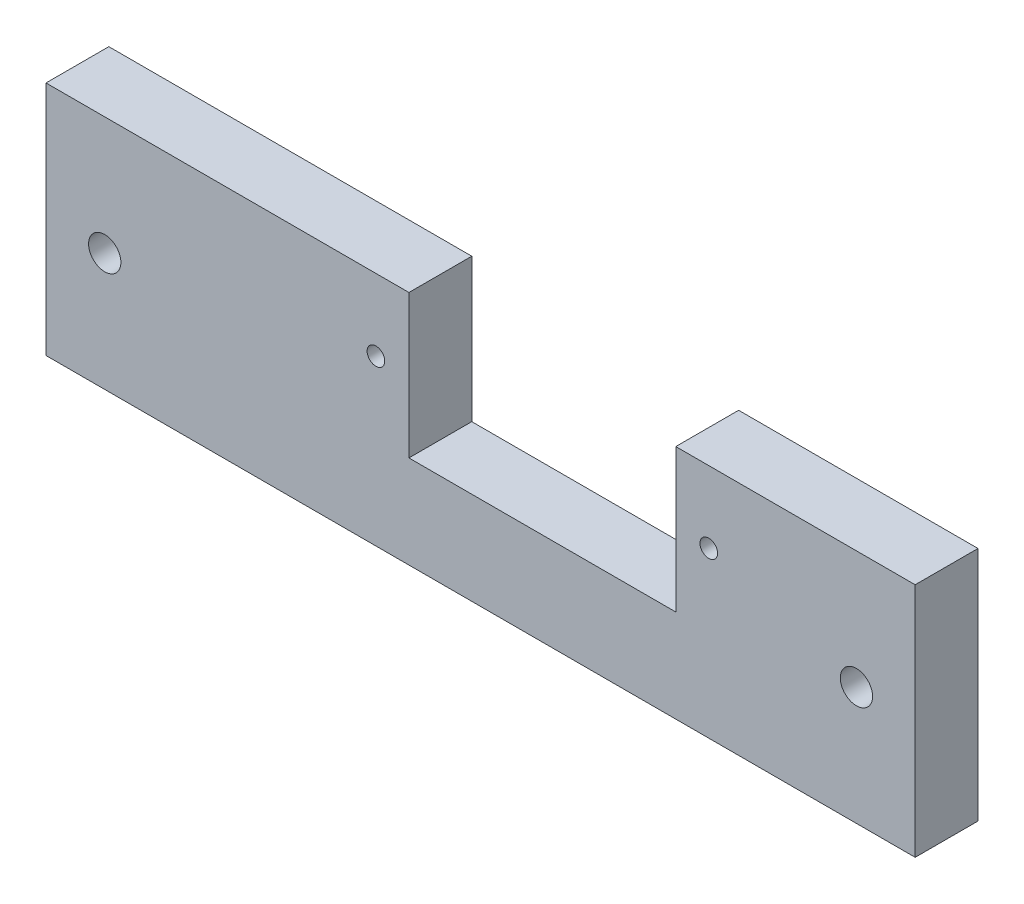
ISO-10303-21;
HEADER;
FILE_DESCRIPTION(('STEP AP214'),'2;1');
FILE_NAME('part.step','',(''),(''),'','','');
FILE_SCHEMA(('AUTOMOTIVE_DESIGN { 1 0 10303 214 1 1 1 1 }'));
ENDSEC;
DATA;
#1=APPLICATION_CONTEXT('core data for automotive mechanical design processes');
#2=APPLICATION_PROTOCOL_DEFINITION('international standard','automotive_design',2000,#1);
#3=PRODUCT_CONTEXT('',#1,'mechanical');
#4=PRODUCT('Part','Part','',(#3));
#5=PRODUCT_RELATED_PRODUCT_CATEGORY('part','',(#4));
#6=PRODUCT_DEFINITION_FORMATION('','',#4);
#7=PRODUCT_DEFINITION_CONTEXT('part definition',#1,'design');
#8=PRODUCT_DEFINITION('design','',#6,#7);
#9=PRODUCT_DEFINITION_SHAPE('','',#8);
#10=(LENGTH_UNIT() NAMED_UNIT(*) SI_UNIT(.MILLI.,.METRE.));
#11=(NAMED_UNIT(*) PLANE_ANGLE_UNIT() SI_UNIT($,.RADIAN.));
#12=(NAMED_UNIT(*) SI_UNIT($,.STERADIAN.) SOLID_ANGLE_UNIT());
#13=UNCERTAINTY_MEASURE_WITH_UNIT(LENGTH_MEASURE(1.E-05),#10,'distance_accuracy_value','');
#14=(GEOMETRIC_REPRESENTATION_CONTEXT(3) GLOBAL_UNCERTAINTY_ASSIGNED_CONTEXT((#13)) GLOBAL_UNIT_ASSIGNED_CONTEXT((#10,
#11,#12)) REPRESENTATION_CONTEXT('',''));
#15=CARTESIAN_POINT('',(0.,0.,0.));
#16=DIRECTION('',(0.,0.,1.));
#17=DIRECTION('',(1.,0.,0.));
#18=AXIS2_PLACEMENT_3D('',#15,#16,#17);
#19=CARTESIAN_POINT('',(0.,20.1,5.35));
#20=DIRECTION('',(0.,1.,0.));
#21=DIRECTION('',(0.,0.,1.));
#22=AXIS2_PLACEMENT_3D('',#19,#20,#21);
#23=PLANE('',#22);
#24=DIRECTION('',(1.,0.,0.));
#25=VECTOR('',#24,1.);
#26=CARTESIAN_POINT('',(0.,20.1,0.));
#27=LINE('',#26,#25);
#28=CARTESIAN_POINT('',(53.62,20.1,0.));
#29=VERTEX_POINT('',#28);
#30=CARTESIAN_POINT('',(74.,20.1,0.));
#31=VERTEX_POINT('',#30);
#32=EDGE_CURVE('E147',#29,#31,#27,.T.);
#33=ORIENTED_EDGE('',*,*,#32,.F.);
#34=DIRECTION('',(0.,0.,-1.));
#35=VECTOR('',#34,1.);
#36=CARTESIAN_POINT('',(53.62,20.1,5.35));
#37=LINE('',#36,#35);
#38=CARTESIAN_POINT('',(53.62,20.1,5.35));
#39=VERTEX_POINT('',#38);
#40=EDGE_CURVE('E11',#39,#29,#37,.T.);
#41=ORIENTED_EDGE('',*,*,#40,.F.);
#42=DIRECTION('',(1.,0.,0.));
#43=VECTOR('',#42,1.);
#44=CARTESIAN_POINT('',(0.,20.1,5.35));
#45=LINE('',#44,#43);
#46=CARTESIAN_POINT('',(74.,20.1,5.35));
#47=VERTEX_POINT('',#46);
#48=EDGE_CURVE('E194',#39,#47,#45,.T.);
#49=ORIENTED_EDGE('',*,*,#48,.T.);
#50=DIRECTION('',(0.,0.,-1.));
#51=VECTOR('',#50,1.);
#52=CARTESIAN_POINT('',(74.,20.1,5.35));
#53=LINE('',#52,#51);
#54=EDGE_CURVE('E87',#47,#31,#53,.T.);
#55=ORIENTED_EDGE('',*,*,#54,.T.);
#56=EDGE_LOOP('',(#33,#41,#49,#55));
#57=FACE_BOUND('',#56,.T.);
#58=ADVANCED_FACE('F35',(#57),#23,.T.);
#59=CARTESIAN_POINT('',(53.62,0.,5.35));
#60=DIRECTION('',(1.,0.,0.));
#61=DIRECTION('',(0.,1.,0.));
#62=AXIS2_PLACEMENT_3D('',#59,#60,#61);
#63=PLANE('',#62);
#64=DIRECTION('',(0.,-1.,0.));
#65=VECTOR('',#64,1.);
#66=CARTESIAN_POINT('',(53.62,0.,0.));
#67=LINE('',#66,#65);
#68=CARTESIAN_POINT('',(53.62,7.9,0.));
#69=VERTEX_POINT('',#68);
#70=EDGE_CURVE('E149',#29,#69,#67,.T.);
#71=ORIENTED_EDGE('',*,*,#70,.T.);
#72=DIRECTION('',(0.,0.,-1.));
#73=VECTOR('',#72,1.);
#74=CARTESIAN_POINT('',(53.62,7.9,5.35));
#75=LINE('',#74,#73);
#76=CARTESIAN_POINT('',(53.62,7.9,5.35));
#77=VERTEX_POINT('',#76);
#78=EDGE_CURVE('E44',#77,#69,#75,.T.);
#79=ORIENTED_EDGE('',*,*,#78,.F.);
#80=DIRECTION('',(0.,-1.,0.));
#81=VECTOR('',#80,1.);
#82=CARTESIAN_POINT('',(53.62,0.,5.35));
#83=LINE('',#82,#81);
#84=EDGE_CURVE('E192',#39,#77,#83,.T.);
#85=ORIENTED_EDGE('',*,*,#84,.F.);
#86=ORIENTED_EDGE('',*,*,#40,.T.);
#87=EDGE_LOOP('',(#71,#79,#85,#86));
#88=FACE_BOUND('',#87,.T.);
#89=ADVANCED_FACE('F184',(#88),#63,.F.);
#90=CARTESIAN_POINT('',(0.,7.9,5.35));
#91=DIRECTION('',(0.,1.,0.));
#92=DIRECTION('',(0.,0.,1.));
#93=AXIS2_PLACEMENT_3D('',#90,#91,#92);
#94=PLANE('',#93);
#95=DIRECTION('',(1.,0.,0.));
#96=VECTOR('',#95,1.);
#97=CARTESIAN_POINT('',(0.,7.9,0.));
#98=LINE('',#97,#96);
#99=CARTESIAN_POINT('',(30.9,7.9,0.));
#100=VERTEX_POINT('',#99);
#101=EDGE_CURVE('E152',#100,#69,#98,.T.);
#102=ORIENTED_EDGE('',*,*,#101,.F.);
#103=DIRECTION('',(0.,0.,-1.));
#104=VECTOR('',#103,1.);
#105=CARTESIAN_POINT('',(30.9,7.9,5.35));
#106=LINE('',#105,#104);
#107=CARTESIAN_POINT('',(30.9,7.9,5.35));
#108=VERTEX_POINT('',#107);
#109=EDGE_CURVE('E174',#108,#100,#106,.T.);
#110=ORIENTED_EDGE('',*,*,#109,.F.);
#111=DIRECTION('',(1.,0.,0.));
#112=VECTOR('',#111,1.);
#113=CARTESIAN_POINT('',(0.,7.9,5.35));
#114=LINE('',#113,#112);
#115=EDGE_CURVE('E181',#108,#77,#114,.T.);
#116=ORIENTED_EDGE('',*,*,#115,.T.);
#117=ORIENTED_EDGE('',*,*,#78,.T.);
#118=EDGE_LOOP('',(#102,#110,#116,#117));
#119=FACE_BOUND('',#118,.T.);
#120=ADVANCED_FACE('F179',(#119),#94,.T.);
#121=CARTESIAN_POINT('',(30.9,0.,5.35));
#122=DIRECTION('',(1.,0.,0.));
#123=DIRECTION('',(0.,1.,0.));
#124=AXIS2_PLACEMENT_3D('',#121,#122,#123);
#125=PLANE('',#124);
#126=DIRECTION('',(0.,-1.,0.));
#127=VECTOR('',#126,1.);
#128=CARTESIAN_POINT('',(30.9,0.,0.));
#129=LINE('',#128,#127);
#130=CARTESIAN_POINT('',(30.9,20.1,0.));
#131=VERTEX_POINT('',#130);
#132=EDGE_CURVE('E155',#131,#100,#129,.T.);
#133=ORIENTED_EDGE('',*,*,#132,.F.);
#134=DIRECTION('',(0.,0.,-1.));
#135=VECTOR('',#134,1.);
#136=CARTESIAN_POINT('',(30.9,20.1,5.35));
#137=LINE('',#136,#135);
#138=CARTESIAN_POINT('',(30.9,20.1,5.35));
#139=VERTEX_POINT('',#138);
#140=EDGE_CURVE('E172',#139,#131,#137,.T.);
#141=ORIENTED_EDGE('',*,*,#140,.F.);
#142=DIRECTION('',(0.,-1.,0.));
#143=VECTOR('',#142,1.);
#144=CARTESIAN_POINT('',(30.9,0.,5.35));
#145=LINE('',#144,#143);
#146=EDGE_CURVE('E130',#139,#108,#145,.T.);
#147=ORIENTED_EDGE('',*,*,#146,.T.);
#148=ORIENTED_EDGE('',*,*,#109,.T.);
#149=EDGE_LOOP('',(#133,#141,#147,#148));
#150=FACE_BOUND('',#149,.T.);
#151=ADVANCED_FACE('F190',(#150),#125,.T.);
#152=CARTESIAN_POINT('',(0.,20.1,5.35));
#153=DIRECTION('',(0.,1.,0.));
#154=DIRECTION('',(0.,0.,1.));
#155=AXIS2_PLACEMENT_3D('',#152,#153,#154);
#156=PLANE('',#155);
#157=DIRECTION('',(1.,0.,0.));
#158=VECTOR('',#157,1.);
#159=CARTESIAN_POINT('',(0.,20.1,0.));
#160=LINE('',#159,#158);
#161=CARTESIAN_POINT('',(0.,20.1,0.));
#162=VERTEX_POINT('',#161);
#163=EDGE_CURVE('E158',#162,#131,#160,.T.);
#164=ORIENTED_EDGE('',*,*,#163,.F.);
#165=DIRECTION('',(0.,0.,-1.));
#166=VECTOR('',#165,1.);
#167=CARTESIAN_POINT('',(0.,20.1,5.35));
#168=LINE('',#167,#166);
#169=CARTESIAN_POINT('',(0.,20.1,5.35));
#170=VERTEX_POINT('',#169);
#171=EDGE_CURVE('E116',#170,#162,#168,.T.);
#172=ORIENTED_EDGE('',*,*,#171,.F.);
#173=DIRECTION('',(1.,0.,0.));
#174=VECTOR('',#173,1.);
#175=CARTESIAN_POINT('',(0.,20.1,5.35));
#176=LINE('',#175,#174);
#177=EDGE_CURVE('E128',#170,#139,#176,.T.);
#178=ORIENTED_EDGE('',*,*,#177,.T.);
#179=ORIENTED_EDGE('',*,*,#140,.T.);
#180=EDGE_LOOP('',(#164,#172,#178,#179));
#181=FACE_BOUND('',#180,.T.);
#182=ADVANCED_FACE('F262',(#181),#156,.T.);
#183=CARTESIAN_POINT('',(0.,0.,5.35));
#184=DIRECTION('',(-1.,0.,0.));
#185=DIRECTION('',(0.,0.,1.));
#186=AXIS2_PLACEMENT_3D('',#183,#184,#185);
#187=PLANE('',#186);
#188=DIRECTION('',(0.,1.,0.));
#189=VECTOR('',#188,1.);
#190=CARTESIAN_POINT('',(0.,0.,0.));
#191=LINE('',#190,#189);
#192=CARTESIAN_POINT('',(0.,0.,0.));
#193=VERTEX_POINT('',#192);
#194=EDGE_CURVE('E113',#193,#162,#191,.T.);
#195=ORIENTED_EDGE('',*,*,#194,.F.);
#196=DIRECTION('',(0.,0.,-1.));
#197=VECTOR('',#196,1.);
#198=CARTESIAN_POINT('',(0.,0.,5.35));
#199=LINE('',#198,#197);
#200=CARTESIAN_POINT('',(0.,0.,5.35));
#201=VERTEX_POINT('',#200);
#202=EDGE_CURVE('E107',#201,#193,#199,.T.);
#203=ORIENTED_EDGE('',*,*,#202,.F.);
#204=DIRECTION('',(0.,1.,0.));
#205=VECTOR('',#204,1.);
#206=CARTESIAN_POINT('',(0.,0.,5.35));
#207=LINE('',#206,#205);
#208=EDGE_CURVE('E111',#201,#170,#207,.T.);
#209=ORIENTED_EDGE('',*,*,#208,.T.);
#210=ORIENTED_EDGE('',*,*,#171,.T.);
#211=EDGE_LOOP('',(#195,#203,#209,#210));
#212=FACE_BOUND('',#211,.T.);
#213=ADVANCED_FACE('F109',(#212),#187,.T.);
#214=CARTESIAN_POINT('',(0.,0.,5.35));
#215=DIRECTION('',(0.,1.,0.));
#216=DIRECTION('',(0.,0.,1.));
#217=AXIS2_PLACEMENT_3D('',#214,#215,#216);
#218=PLANE('',#217);
#219=DIRECTION('',(1.,0.,0.));
#220=VECTOR('',#219,1.);
#221=CARTESIAN_POINT('',(0.,0.,0.));
#222=LINE('',#221,#220);
#223=CARTESIAN_POINT('',(74.,0.,0.));
#224=VERTEX_POINT('',#223);
#225=EDGE_CURVE('E162',#193,#224,#222,.T.);
#226=ORIENTED_EDGE('',*,*,#225,.T.);
#227=DIRECTION('',(0.,0.,-1.));
#228=VECTOR('',#227,1.);
#229=CARTESIAN_POINT('',(74.,0.,5.35));
#230=LINE('',#229,#228);
#231=CARTESIAN_POINT('',(74.,0.,5.35));
#232=VERTEX_POINT('',#231);
#233=EDGE_CURVE('E117',#232,#224,#230,.T.);
#234=ORIENTED_EDGE('',*,*,#233,.F.);
#235=DIRECTION('',(1.,0.,0.));
#236=VECTOR('',#235,1.);
#237=CARTESIAN_POINT('',(0.,0.,5.35));
#238=LINE('',#237,#236);
#239=EDGE_CURVE('E120',#201,#232,#238,.T.);
#240=ORIENTED_EDGE('',*,*,#239,.F.);
#241=ORIENTED_EDGE('',*,*,#202,.T.);
#242=EDGE_LOOP('',(#226,#234,#240,#241));
#243=FACE_BOUND('',#242,.T.);
#244=ADVANCED_FACE('F121',(#243),#218,.F.);
#245=CARTESIAN_POINT('',(74.,0.,5.35));
#246=DIRECTION('',(-1.,0.,0.));
#247=DIRECTION('',(0.,0.,1.));
#248=AXIS2_PLACEMENT_3D('',#245,#246,#247);
#249=PLANE('',#248);
#250=DIRECTION('',(0.,1.,0.));
#251=VECTOR('',#250,1.);
#252=CARTESIAN_POINT('',(74.,0.,0.));
#253=LINE('',#252,#251);
#254=EDGE_CURVE('E80',#224,#31,#253,.T.);
#255=ORIENTED_EDGE('',*,*,#254,.T.);
#256=ORIENTED_EDGE('',*,*,#54,.F.);
#257=DIRECTION('',(0.,1.,0.));
#258=VECTOR('',#257,1.);
#259=CARTESIAN_POINT('',(74.,0.,5.35));
#260=LINE('',#259,#258);
#261=EDGE_CURVE('E52',#232,#47,#260,.T.);
#262=ORIENTED_EDGE('',*,*,#261,.F.);
#263=ORIENTED_EDGE('',*,*,#233,.T.);
#264=EDGE_LOOP('',(#255,#256,#262,#263));
#265=FACE_BOUND('',#264,.T.);
#266=ADVANCED_FACE('F221',(#265),#249,.F.);
#267=CARTESIAN_POINT('',(28.09,14.,5.35));
#268=DIRECTION('',(0.,0.,-1.));
#269=DIRECTION('',(-1.,0.,0.));
#270=AXIS2_PLACEMENT_3D('',#267,#268,#269);
#271=CYLINDRICAL_SURFACE('',#270,0.750000000000002);
#272=CARTESIAN_POINT('',(28.09,14.,5.35));
#273=DIRECTION('',(0.,0.,1.));
#274=DIRECTION('',(1.,0.,0.));
#275=AXIS2_PLACEMENT_3D('',#272,#273,#274);
#276=CIRCLE('',#275,0.750000000000002);
#277=CARTESIAN_POINT('',(28.84,14.,5.35));
#278=VERTEX_POINT('',#277);
#279=EDGE_CURVE('E198',#278,#278,#276,.T.);
#280=ORIENTED_EDGE('',*,*,#279,.T.);
#281=EDGE_LOOP('',(#280));
#282=FACE_BOUND('',#281,.T.);
#283=CARTESIAN_POINT('',(28.09,14.,0.));
#284=DIRECTION('',(0.,0.,1.));
#285=DIRECTION('',(1.,0.,0.));
#286=AXIS2_PLACEMENT_3D('',#283,#284,#285);
#287=CIRCLE('',#286,0.750000000000002);
#288=CARTESIAN_POINT('',(28.84,14.,0.));
#289=VERTEX_POINT('',#288);
#290=EDGE_CURVE('E144',#289,#289,#287,.T.);
#291=ORIENTED_EDGE('',*,*,#290,.F.);
#292=EDGE_LOOP('',(#291));
#293=FACE_BOUND('',#292,.T.);
#294=ADVANCED_FACE('F217',(#282,#293),#271,.F.);
#295=CARTESIAN_POINT('',(56.43,14.,5.35));
#296=DIRECTION('',(0.,0.,-1.));
#297=DIRECTION('',(-1.,0.,0.));
#298=AXIS2_PLACEMENT_3D('',#295,#296,#297);
#299=CYLINDRICAL_SURFACE('',#298,0.750000000000005);
#300=CARTESIAN_POINT('',(56.43,14.,5.35));
#301=DIRECTION('',(0.,0.,1.));
#302=DIRECTION('',(1.,0.,0.));
#303=AXIS2_PLACEMENT_3D('',#300,#301,#302);
#304=CIRCLE('',#303,0.750000000000005);
#305=CARTESIAN_POINT('',(57.18,14.,5.35));
#306=VERTEX_POINT('',#305);
#307=EDGE_CURVE('E201',#306,#306,#304,.F.);
#308=ORIENTED_EDGE('',*,*,#307,.F.);
#309=EDGE_LOOP('',(#308));
#310=FACE_BOUND('',#309,.T.);
#311=CARTESIAN_POINT('',(56.43,14.,0.));
#312=DIRECTION('',(0.,0.,1.));
#313=DIRECTION('',(1.,0.,0.));
#314=AXIS2_PLACEMENT_3D('',#311,#312,#313);
#315=CIRCLE('',#314,0.750000000000005);
#316=CARTESIAN_POINT('',(57.18,14.,0.));
#317=VERTEX_POINT('',#316);
#318=EDGE_CURVE('E141',#317,#317,#315,.F.);
#319=ORIENTED_EDGE('',*,*,#318,.T.);
#320=EDGE_LOOP('',(#319));
#321=FACE_BOUND('',#320,.T.);
#322=ADVANCED_FACE('F220',(#310,#321),#299,.F.);
#323=CARTESIAN_POINT('',(5.,10.05,5.35));
#324=DIRECTION('',(0.,0.,-1.));
#325=DIRECTION('',(-1.,0.,0.));
#326=AXIS2_PLACEMENT_3D('',#323,#324,#325);
#327=CYLINDRICAL_SURFACE('',#326,1.375);
#328=CARTESIAN_POINT('',(5.,10.05,5.35));
#329=DIRECTION('',(0.,0.,1.));
#330=DIRECTION('',(1.,0.,0.));
#331=AXIS2_PLACEMENT_3D('',#328,#329,#330);
#332=CIRCLE('',#331,1.375);
#333=CARTESIAN_POINT('',(6.375,10.05,5.35));
#334=VERTEX_POINT('',#333);
#335=EDGE_CURVE('E168',#334,#334,#332,.T.);
#336=ORIENTED_EDGE('',*,*,#335,.T.);
#337=EDGE_LOOP('',(#336));
#338=FACE_BOUND('',#337,.T.);
#339=CARTESIAN_POINT('',(5.,10.05,0.));
#340=DIRECTION('',(0.,0.,1.));
#341=DIRECTION('',(1.,0.,0.));
#342=AXIS2_PLACEMENT_3D('',#339,#340,#341);
#343=CIRCLE('',#342,1.375);
#344=CARTESIAN_POINT('',(6.375,10.05,0.));
#345=VERTEX_POINT('',#344);
#346=EDGE_CURVE('E138',#345,#345,#343,.T.);
#347=ORIENTED_EDGE('',*,*,#346,.F.);
#348=EDGE_LOOP('',(#347));
#349=FACE_BOUND('',#348,.T.);
#350=ADVANCED_FACE('F37',(#338,#349),#327,.F.);
#351=CARTESIAN_POINT('',(69.,10.05,5.35));
#352=DIRECTION('',(0.,0.,-1.));
#353=DIRECTION('',(-1.,0.,0.));
#354=AXIS2_PLACEMENT_3D('',#351,#352,#353);
#355=CYLINDRICAL_SURFACE('',#354,1.375);
#356=CARTESIAN_POINT('',(69.,10.05,5.35));
#357=DIRECTION('',(0.,0.,1.));
#358=DIRECTION('',(1.,0.,0.));
#359=AXIS2_PLACEMENT_3D('',#356,#357,#358);
#360=CIRCLE('',#359,1.375);
#361=CARTESIAN_POINT('',(70.375,10.05,5.35));
#362=VERTEX_POINT('',#361);
#363=EDGE_CURVE('E135',#362,#362,#360,.F.);
#364=ORIENTED_EDGE('',*,*,#363,.F.);
#365=EDGE_LOOP('',(#364));
#366=FACE_BOUND('',#365,.T.);
#367=CARTESIAN_POINT('',(69.,10.05,0.));
#368=DIRECTION('',(0.,0.,1.));
#369=DIRECTION('',(1.,0.,0.));
#370=AXIS2_PLACEMENT_3D('',#367,#368,#369);
#371=CIRCLE('',#370,1.375);
#372=CARTESIAN_POINT('',(70.375,10.05,0.));
#373=VERTEX_POINT('',#372);
#374=EDGE_CURVE('E165',#373,#373,#371,.F.);
#375=ORIENTED_EDGE('',*,*,#374,.T.);
#376=EDGE_LOOP('',(#375));
#377=FACE_BOUND('',#376,.T.);
#378=ADVANCED_FACE('F211',(#366,#377),#355,.F.);
#379=CARTESIAN_POINT('',(0.,0.,5.35));
#380=DIRECTION('',(0.,0.,1.));
#381=DIRECTION('',(1.,0.,0.));
#382=AXIS2_PLACEMENT_3D('',#379,#380,#381);
#383=PLANE('',#382);
#384=ORIENTED_EDGE('',*,*,#335,.F.);
#385=EDGE_LOOP('',(#384));
#386=FACE_BOUND('',#385,.T.);
#387=ORIENTED_EDGE('',*,*,#307,.T.);
#388=EDGE_LOOP('',(#387));
#389=FACE_BOUND('',#388,.T.);
#390=ORIENTED_EDGE('',*,*,#279,.F.);
#391=EDGE_LOOP('',(#390));
#392=FACE_BOUND('',#391,.T.);
#393=ORIENTED_EDGE('',*,*,#48,.F.);
#394=ORIENTED_EDGE('',*,*,#84,.T.);
#395=ORIENTED_EDGE('',*,*,#115,.F.);
#396=ORIENTED_EDGE('',*,*,#146,.F.);
#397=ORIENTED_EDGE('',*,*,#177,.F.);
#398=ORIENTED_EDGE('',*,*,#208,.F.);
#399=ORIENTED_EDGE('',*,*,#239,.T.);
#400=ORIENTED_EDGE('',*,*,#261,.T.);
#401=EDGE_LOOP('',(#393,#394,#395,#396,#397,#398,#399,#400));
#402=FACE_BOUND('',#401,.T.);
#403=ORIENTED_EDGE('',*,*,#363,.T.);
#404=EDGE_LOOP('',(#403));
#405=FACE_BOUND('',#404,.T.);
#406=ADVANCED_FACE('F124',(#386,#389,#392,#402,#405),#383,.T.);
#407=CARTESIAN_POINT('',(0.,0.,0.));
#408=DIRECTION('',(0.,0.,1.));
#409=DIRECTION('',(1.,0.,0.));
#410=AXIS2_PLACEMENT_3D('',#407,#408,#409);
#411=PLANE('',#410);
#412=ORIENTED_EDGE('',*,*,#346,.T.);
#413=EDGE_LOOP('',(#412));
#414=FACE_BOUND('',#413,.T.);
#415=ORIENTED_EDGE('',*,*,#318,.F.);
#416=EDGE_LOOP('',(#415));
#417=FACE_BOUND('',#416,.T.);
#418=ORIENTED_EDGE('',*,*,#290,.T.);
#419=EDGE_LOOP('',(#418));
#420=FACE_BOUND('',#419,.T.);
#421=ORIENTED_EDGE('',*,*,#32,.T.);
#422=ORIENTED_EDGE('',*,*,#254,.F.);
#423=ORIENTED_EDGE('',*,*,#225,.F.);
#424=ORIENTED_EDGE('',*,*,#194,.T.);
#425=ORIENTED_EDGE('',*,*,#163,.T.);
#426=ORIENTED_EDGE('',*,*,#132,.T.);
#427=ORIENTED_EDGE('',*,*,#101,.T.);
#428=ORIENTED_EDGE('',*,*,#70,.F.);
#429=EDGE_LOOP('',(#421,#422,#423,#424,#425,#426,#427,#428));
#430=FACE_BOUND('',#429,.T.);
#431=ORIENTED_EDGE('',*,*,#374,.F.);
#432=EDGE_LOOP('',(#431));
#433=FACE_BOUND('',#432,.T.);
#434=ADVANCED_FACE('F185',(#414,#417,#420,#430,#433),#411,.F.);
#435=CLOSED_SHELL('',(#58,#89,#120,#151,#182,#213,#244,#266,#294,#322,#350,#378,#406,#434));
#436=MANIFOLD_SOLID_BREP('B2',#435);
#437=ADVANCED_BREP_SHAPE_REPRESENTATION('',(#18,#436),#14);
#438=SHAPE_DEFINITION_REPRESENTATION(#9,#437);
ENDSEC;
END-ISO-10303-21;
